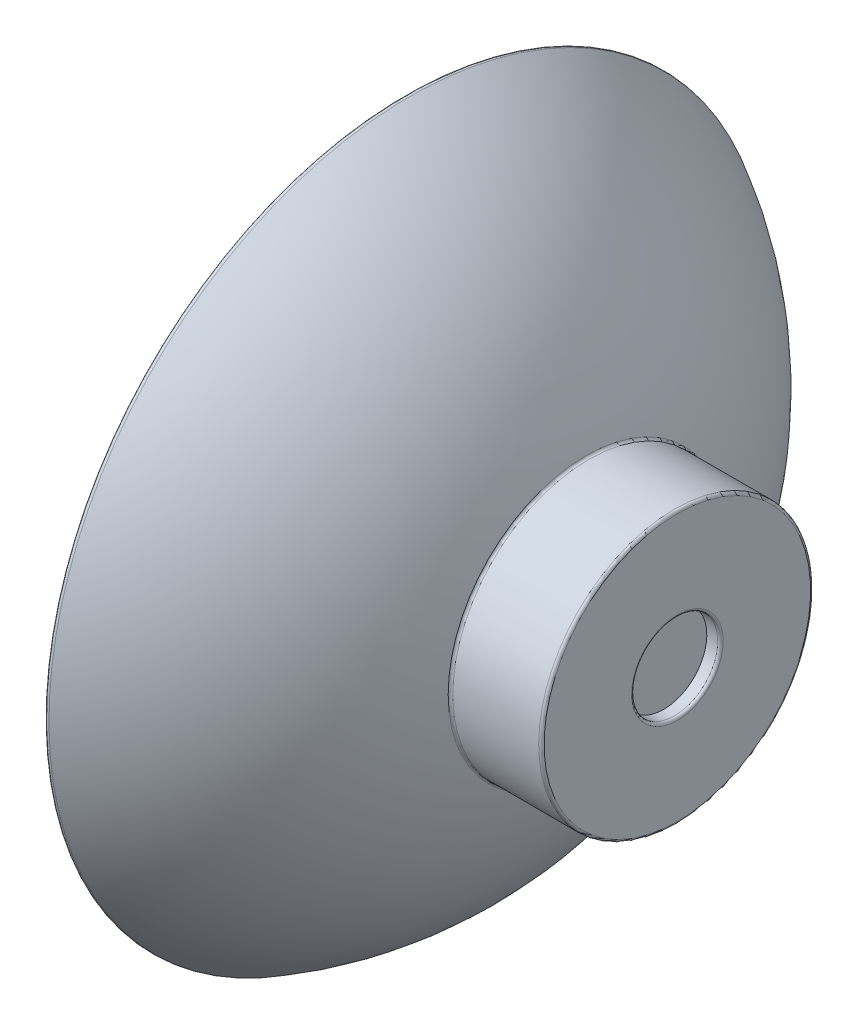
ISO-10303-21;
HEADER;
FILE_DESCRIPTION(('STEP AP214'),'2;1');
FILE_NAME('part.step','',(''),(''),'','','');
FILE_SCHEMA(('AUTOMOTIVE_DESIGN { 1 0 10303 214 1 1 1 1 }'));
ENDSEC;
DATA;
#1=APPLICATION_CONTEXT('core data for automotive mechanical design processes');
#2=APPLICATION_PROTOCOL_DEFINITION('international standard','automotive_design',2000,#1);
#3=PRODUCT_CONTEXT('',#1,'mechanical');
#4=PRODUCT('Part','Part','',(#3));
#5=PRODUCT_RELATED_PRODUCT_CATEGORY('part','',(#4));
#6=PRODUCT_DEFINITION_FORMATION('','',#4);
#7=PRODUCT_DEFINITION_CONTEXT('part definition',#1,'design');
#8=PRODUCT_DEFINITION('design','',#6,#7);
#9=PRODUCT_DEFINITION_SHAPE('','',#8);
#10=(LENGTH_UNIT() NAMED_UNIT(*) SI_UNIT(.MILLI.,.METRE.));
#11=(NAMED_UNIT(*) PLANE_ANGLE_UNIT() SI_UNIT($,.RADIAN.));
#12=(NAMED_UNIT(*) SI_UNIT($,.STERADIAN.) SOLID_ANGLE_UNIT());
#13=UNCERTAINTY_MEASURE_WITH_UNIT(LENGTH_MEASURE(1.E-05),#10,'distance_accuracy_value','');
#14=(GEOMETRIC_REPRESENTATION_CONTEXT(3) GLOBAL_UNCERTAINTY_ASSIGNED_CONTEXT((#13)) GLOBAL_UNIT_ASSIGNED_CONTEXT((#10,
#11,#12)) REPRESENTATION_CONTEXT('',''));
#15=CARTESIAN_POINT('',(0.,0.,0.));
#16=DIRECTION('',(0.,0.,1.));
#17=DIRECTION('',(1.,0.,0.));
#18=AXIS2_PLACEMENT_3D('',#15,#16,#17);
#19=CARTESIAN_POINT('',(-10.,0.,0.));
#20=DIRECTION('',(-1.,0.,0.));
#21=DIRECTION('',(0.,-1.,0.));
#22=AXIS2_PLACEMENT_3D('',#19,#20,#21);
#23=PLANE('',#22);
#24=CARTESIAN_POINT('',(-10.,0.,0.));
#25=DIRECTION('',(-1.,0.,0.));
#26=DIRECTION('',(0.,-1.,0.));
#27=AXIS2_PLACEMENT_3D('',#24,#25,#26);
#28=CIRCLE('',#27,19.7498201412628);
#29=CARTESIAN_POINT('',(-10.,-19.7498201412628,0.));
#30=VERTEX_POINT('',#29);
#31=EDGE_CURVE('E58',#30,#30,#28,.T.);
#32=ORIENTED_EDGE('',*,*,#31,.T.);
#33=EDGE_LOOP('',(#32));
#34=FACE_BOUND('',#33,.T.);
#35=CARTESIAN_POINT('',(-10.,0.,0.));
#36=DIRECTION('',(-1.,0.,0.));
#37=DIRECTION('',(0.,-1.,0.));
#38=AXIS2_PLACEMENT_3D('',#35,#36,#37);
#39=CIRCLE('',#38,18.9049521813844);
#40=CARTESIAN_POINT('',(-10.,-18.9049521813844,0.));
#41=VERTEX_POINT('',#40);
#42=EDGE_CURVE('E88',#41,#41,#39,.F.);
#43=ORIENTED_EDGE('',*,*,#42,.T.);
#44=EDGE_LOOP('',(#43));
#45=FACE_BOUND('',#44,.T.);
#46=ADVANCED_FACE('F46',(#34,#45),#23,.T.);
#47=CARTESIAN_POINT('',(-21.663773257461,0.,0.));
#48=DIRECTION('',(1.,0.,0.));
#49=DIRECTION('',(0.,1.,0.));
#50=AXIS2_PLACEMENT_3D('',#47,#48,#49);
#51=DEGENERATE_TOROIDAL_SURFACE('',#50,0.168430054231302,22.,.T.);
#52=CARTESIAN_POINT('',(-9.93000297917016,0.,0.));
#53=DIRECTION('',(-1.,0.,0.));
#54=DIRECTION('',(0.,-1.,0.));
#55=AXIS2_PLACEMENT_3D('',#52,#53,#54);
#56=CIRCLE('',#55,18.7780682843608);
#57=CARTESIAN_POINT('',(-9.93000297917016,-18.7780682843608,0.));
#58=VERTEX_POINT('',#57);
#59=EDGE_CURVE('E82',#58,#58,#56,.T.);
#60=ORIENTED_EDGE('',*,*,#59,.T.);
#61=EDGE_LOOP('',(#60));
#62=FACE_BOUND('',#61,.T.);
#63=CARTESIAN_POINT('',(-0.00230819274053828,0.,0.));
#64=DIRECTION('',(-1.,0.,0.));
#65=DIRECTION('',(0.,-1.,0.));
#66=AXIS2_PLACEMENT_3D('',#63,#64,#65);
#67=CIRCLE('',#66,4.01302772497597);
#68=CARTESIAN_POINT('',(-0.00230819274053779,-4.01302772497597,0.));
#69=VERTEX_POINT('',#68);
#70=EDGE_CURVE('E85',#69,#69,#67,.F.);
#71=ORIENTED_EDGE('',*,*,#70,.T.);
#72=EDGE_LOOP('',(#71));
#73=FACE_BOUND('',#72,.T.);
#74=ADVANCED_FACE('F117',(#62,#73),#51,.F.);
#75=CARTESIAN_POINT('',(0.,0.,0.));
#76=DIRECTION('',(1.,0.,0.));
#77=DIRECTION('',(0.,1.,0.));
#78=AXIS2_PLACEMENT_3D('',#75,#76,#77);
#79=PLANE('',#78);
#80=CARTESIAN_POINT('',(0.,0.,0.));
#81=DIRECTION('',(1.,0.,0.));
#82=DIRECTION('',(0.,1.,0.));
#83=AXIS2_PLACEMENT_3D('',#80,#81,#82);
#84=CIRCLE('',#83,3.98681455903907);
#85=CARTESIAN_POINT('',(0.,3.98681455903907,0.));
#86=VERTEX_POINT('',#85);
#87=EDGE_CURVE('E79',#86,#86,#84,.F.);
#88=ORIENTED_EDGE('',*,*,#87,.T.);
#89=EDGE_LOOP('',(#88));
#90=FACE_BOUND('',#89,.T.);
#91=ADVANCED_FACE('F123',(#90),#79,.F.);
#92=CARTESIAN_POINT('',(5.,0.,0.));
#93=DIRECTION('',(-1.,0.,0.));
#94=DIRECTION('',(0.,-1.,0.));
#95=AXIS2_PLACEMENT_3D('',#92,#93,#94);
#96=PLANE('',#95);
#97=CARTESIAN_POINT('',(5.,0.,0.));
#98=DIRECTION('',(-1.,0.,0.));
#99=DIRECTION('',(0.,-1.,0.));
#100=AXIS2_PLACEMENT_3D('',#97,#98,#99);
#101=CIRCLE('',#100,2.525);
#102=CARTESIAN_POINT('',(5.,-2.525,0.));
#103=VERTEX_POINT('',#102);
#104=EDGE_CURVE('E11',#103,#103,#101,.T.);
#105=ORIENTED_EDGE('',*,*,#104,.T.);
#106=EDGE_LOOP('',(#105));
#107=FACE_BOUND('',#106,.T.);
#108=CARTESIAN_POINT('',(5.,0.,0.));
#109=DIRECTION('',(-1.,0.,0.));
#110=DIRECTION('',(0.,-1.,0.));
#111=AXIS2_PLACEMENT_3D('',#108,#109,#110);
#112=CIRCLE('',#111,7.35);
#113=CARTESIAN_POINT('',(5.,-7.35,0.));
#114=VERTEX_POINT('',#113);
#115=EDGE_CURVE('E67',#114,#114,#112,.F.);
#116=ORIENTED_EDGE('',*,*,#115,.T.);
#117=EDGE_LOOP('',(#116));
#118=FACE_BOUND('',#117,.T.);
#119=ADVANCED_FACE('F160',(#107,#118),#96,.F.);
#120=CARTESIAN_POINT('',(0.,0.,0.));
#121=DIRECTION('',(1.,0.,0.));
#122=DIRECTION('',(0.,1.,0.));
#123=AXIS2_PLACEMENT_3D('',#120,#121,#122);
#124=CYLINDRICAL_SURFACE('',#123,7.5);
#125=CARTESIAN_POINT('',(0.114614627606932,0.,0.));
#126=DIRECTION('',(1.,0.,0.));
#127=DIRECTION('',(0.,1.,0.));
#128=AXIS2_PLACEMENT_3D('',#125,#126,#127);
#129=CIRCLE('',#128,7.5);
#130=CARTESIAN_POINT('',(0.114614627606932,7.5,0.));
#131=VERTEX_POINT('',#130);
#132=EDGE_CURVE('E73',#131,#131,#129,.T.);
#133=ORIENTED_EDGE('',*,*,#132,.T.);
#134=EDGE_LOOP('',(#133));
#135=FACE_BOUND('',#134,.T.);
#136=CARTESIAN_POINT('',(4.85,0.,0.));
#137=DIRECTION('',(-1.,0.,0.));
#138=DIRECTION('',(0.,-1.,0.));
#139=AXIS2_PLACEMENT_3D('',#136,#137,#138);
#140=CIRCLE('',#139,7.5);
#141=CARTESIAN_POINT('',(4.85,-7.5,0.));
#142=VERTEX_POINT('',#141);
#143=EDGE_CURVE('E76',#142,#142,#140,.T.);
#144=ORIENTED_EDGE('',*,*,#143,.T.);
#145=EDGE_LOOP('',(#144));
#146=FACE_BOUND('',#145,.T.);
#147=ADVANCED_FACE('F113',(#135,#146),#124,.T.);
#148=CARTESIAN_POINT('',(-19.3122304000596,0.,0.));
#149=DIRECTION('',(1.,0.,0.));
#150=DIRECTION('',(0.,1.,0.));
#151=AXIS2_PLACEMENT_3D('',#148,#149,#150);
#152=DEGENERATE_TOROIDAL_SURFACE('',#151,2.30021567995232,20.,.T.);
#153=CARTESIAN_POINT('',(-9.77849699949577,0.,0.));
#154=DIRECTION('',(-1.,0.,0.));
#155=DIRECTION('',(0.,-1.,0.));
#156=AXIS2_PLACEMENT_3D('',#153,#154,#155);
#157=CIRCLE('',#156,19.8816811321543);
#158=CARTESIAN_POINT('',(-9.77849699949577,-19.8816811321543,0.));
#159=VERTEX_POINT('',#158);
#160=EDGE_CURVE('E62',#159,#159,#157,.F.);
#161=ORIENTED_EDGE('',*,*,#160,.T.);
#162=EDGE_LOOP('',(#161));
#163=FACE_BOUND('',#162,.T.);
#164=CARTESIAN_POINT('',(-0.0300020847578304,0.,0.));
#165=DIRECTION('',(-1.,0.,0.));
#166=DIRECTION('',(0.,-1.,0.));
#167=AXIS2_PLACEMENT_3D('',#164,#165,#166);
#168=CIRCLE('',#167,7.61017530282843);
#169=CARTESIAN_POINT('',(-0.0300020847578295,-7.61017530282843,0.));
#170=VERTEX_POINT('',#169);
#171=EDGE_CURVE('E70',#170,#170,#168,.T.);
#172=ORIENTED_EDGE('',*,*,#171,.T.);
#173=EDGE_LOOP('',(#172));
#174=FACE_BOUND('',#173,.T.);
#175=ADVANCED_FACE('F105',(#163,#174),#152,.T.);
#176=CARTESIAN_POINT('',(4.25,0.,0.));
#177=DIRECTION('',(1.,0.,0.));
#178=DIRECTION('',(0.,1.,0.));
#179=AXIS2_PLACEMENT_3D('',#176,#177,#178);
#180=CYLINDRICAL_SURFACE('',#179,2.375);
#181=CARTESIAN_POINT('',(4.85,0.,0.));
#182=DIRECTION('',(-1.,0.,0.));
#183=DIRECTION('',(0.,-1.,0.));
#184=AXIS2_PLACEMENT_3D('',#181,#182,#183);
#185=CIRCLE('',#184,2.375);
#186=CARTESIAN_POINT('',(4.85,-2.375,0.));
#187=VERTEX_POINT('',#186);
#188=EDGE_CURVE('E54',#187,#187,#185,.F.);
#189=ORIENTED_EDGE('',*,*,#188,.T.);
#190=EDGE_LOOP('',(#189));
#191=FACE_BOUND('',#190,.T.);
#192=CARTESIAN_POINT('',(4.25,0.,0.));
#193=DIRECTION('',(1.,0.,0.));
#194=DIRECTION('',(0.,1.,0.));
#195=AXIS2_PLACEMENT_3D('',#192,#193,#194);
#196=CIRCLE('',#195,2.375);
#197=CARTESIAN_POINT('',(4.25,2.375,0.));
#198=VERTEX_POINT('',#197);
#199=EDGE_CURVE('E97',#198,#198,#196,.T.);
#200=ORIENTED_EDGE('',*,*,#199,.F.);
#201=EDGE_LOOP('',(#200));
#202=FACE_BOUND('',#201,.T.);
#203=ADVANCED_FACE('F103',(#191,#202),#180,.F.);
#204=CARTESIAN_POINT('',(4.25,0.,0.));
#205=DIRECTION('',(1.,0.,0.));
#206=DIRECTION('',(0.,1.,0.));
#207=AXIS2_PLACEMENT_3D('',#204,#205,#206);
#208=PLANE('',#207);
#209=ORIENTED_EDGE('',*,*,#199,.T.);
#210=EDGE_LOOP('',(#209));
#211=FACE_BOUND('',#210,.T.);
#212=ADVANCED_FACE('F101',(#211),#208,.T.);
#213=CARTESIAN_POINT('',(-9.85,0.,0.));
#214=DIRECTION('',(-1.,0.,0.));
#215=DIRECTION('',(0.,-1.,0.));
#216=AXIS2_PLACEMENT_3D('',#213,#214,#215);
#217=TOROIDAL_SURFACE('',#216,18.9049521813844,0.15);
#218=ORIENTED_EDGE('',*,*,#59,.F.);
#219=EDGE_LOOP('',(#218));
#220=FACE_BOUND('',#219,.T.);
#221=ORIENTED_EDGE('',*,*,#42,.F.);
#222=EDGE_LOOP('',(#221));
#223=FACE_BOUND('',#222,.T.);
#224=ADVANCED_FACE('F111',(#220,#223),#217,.T.);
#225=CARTESIAN_POINT('',(-0.150000000000001,0.,0.));
#226=DIRECTION('',(1.,0.,0.));
#227=DIRECTION('',(0.,1.,0.));
#228=AXIS2_PLACEMENT_3D('',#225,#226,#227);
#229=TOROIDAL_SURFACE('',#228,3.98681455903907,0.15);
#230=ORIENTED_EDGE('',*,*,#87,.F.);
#231=EDGE_LOOP('',(#230));
#232=FACE_BOUND('',#231,.T.);
#233=ORIENTED_EDGE('',*,*,#70,.F.);
#234=EDGE_LOOP('',(#233));
#235=FACE_BOUND('',#234,.T.);
#236=ADVANCED_FACE('F131',(#232,#235),#229,.F.);
#237=CARTESIAN_POINT('',(0.114614627606932,0.,0.));
#238=DIRECTION('',(1.,0.,0.));
#239=DIRECTION('',(0.,1.,0.));
#240=AXIS2_PLACEMENT_3D('',#237,#238,#239);
#241=TOROIDAL_SURFACE('',#240,7.65,0.15);
#242=ORIENTED_EDGE('',*,*,#171,.F.);
#243=EDGE_LOOP('',(#242));
#244=FACE_BOUND('',#243,.T.);
#245=ORIENTED_EDGE('',*,*,#132,.F.);
#246=EDGE_LOOP('',(#245));
#247=FACE_BOUND('',#246,.T.);
#248=ADVANCED_FACE('F135',(#244,#247),#241,.F.);
#249=CARTESIAN_POINT('',(4.85,0.,0.));
#250=DIRECTION('',(-1.,0.,0.));
#251=DIRECTION('',(0.,-1.,0.));
#252=AXIS2_PLACEMENT_3D('',#249,#250,#251);
#253=TOROIDAL_SURFACE('',#252,7.35,0.15);
#254=ORIENTED_EDGE('',*,*,#143,.F.);
#255=EDGE_LOOP('',(#254));
#256=FACE_BOUND('',#255,.T.);
#257=ORIENTED_EDGE('',*,*,#115,.F.);
#258=EDGE_LOOP('',(#257));
#259=FACE_BOUND('',#258,.T.);
#260=ADVANCED_FACE('F139',(#256,#259),#253,.T.);
#261=CARTESIAN_POINT('',(-9.85,0.,0.));
#262=DIRECTION('',(-1.,0.,0.));
#263=DIRECTION('',(0.,-1.,0.));
#264=AXIS2_PLACEMENT_3D('',#261,#262,#263);
#265=TOROIDAL_SURFACE('',#264,19.7498201412628,0.15);
#266=ORIENTED_EDGE('',*,*,#31,.F.);
#267=EDGE_LOOP('',(#266));
#268=FACE_BOUND('',#267,.T.);
#269=ORIENTED_EDGE('',*,*,#160,.F.);
#270=EDGE_LOOP('',(#269));
#271=FACE_BOUND('',#270,.T.);
#272=ADVANCED_FACE('F142',(#268,#271),#265,.T.);
#273=CARTESIAN_POINT('',(4.85,0.,0.));
#274=DIRECTION('',(-1.,0.,0.));
#275=DIRECTION('',(0.,-1.,0.));
#276=AXIS2_PLACEMENT_3D('',#273,#274,#275);
#277=TOROIDAL_SURFACE('',#276,2.525,0.15);
#278=ORIENTED_EDGE('',*,*,#104,.F.);
#279=EDGE_LOOP('',(#278));
#280=FACE_BOUND('',#279,.T.);
#281=ORIENTED_EDGE('',*,*,#188,.F.);
#282=EDGE_LOOP('',(#281));
#283=FACE_BOUND('',#282,.T.);
#284=ADVANCED_FACE('F48',(#280,#283),#277,.T.);
#285=CLOSED_SHELL('',(#46,#74,#91,#119,#147,#175,#203,#212,#224,#236,#248,#260,#272,#284));
#286=CARTESIAN_POINT('',(2.,0.,0.));
#287=DIRECTION('',(1.,0.,0.));
#288=DIRECTION('',(0.,1.,0.));
#289=AXIS2_PLACEMENT_3D('',#286,#287,#288);
#290=PLANE('',#289);
#291=CARTESIAN_POINT('',(2.,0.,0.));
#292=DIRECTION('',(1.,0.,0.));
#293=DIRECTION('',(0.,1.,0.));
#294=AXIS2_PLACEMENT_3D('',#291,#292,#293);
#295=CIRCLE('',#294,4.75);
#296=CARTESIAN_POINT('',(2.,4.75,0.));
#297=VERTEX_POINT('',#296);
#298=EDGE_CURVE('E91',#297,#297,#295,.T.);
#299=ORIENTED_EDGE('',*,*,#298,.T.);
#300=EDGE_LOOP('',(#299));
#301=FACE_BOUND('',#300,.T.);
#302=ADVANCED_FACE('F181',(#301),#290,.T.);
#303=CARTESIAN_POINT('',(0.,0.,0.));
#304=DIRECTION('',(1.,0.,0.));
#305=DIRECTION('',(0.,1.,0.));
#306=AXIS2_PLACEMENT_3D('',#303,#304,#305);
#307=CYLINDRICAL_SURFACE('',#306,4.75);
#308=CARTESIAN_POINT('',(4.,0.,0.));
#309=DIRECTION('',(1.,0.,0.));
#310=DIRECTION('',(0.,1.,0.));
#311=AXIS2_PLACEMENT_3D('',#308,#309,#310);
#312=CIRCLE('',#311,4.75);
#313=CARTESIAN_POINT('',(4.,4.75,0.));
#314=VERTEX_POINT('',#313);
#315=EDGE_CURVE('E94',#314,#314,#312,.T.);
#316=ORIENTED_EDGE('',*,*,#315,.T.);
#317=EDGE_LOOP('',(#316));
#318=FACE_BOUND('',#317,.T.);
#319=ORIENTED_EDGE('',*,*,#298,.F.);
#320=EDGE_LOOP('',(#319));
#321=FACE_BOUND('',#320,.T.);
#322=ADVANCED_FACE('F176',(#318,#321),#307,.F.);
#323=CARTESIAN_POINT('',(4.,0.,0.));
#324=DIRECTION('',(-1.,0.,0.));
#325=DIRECTION('',(0.,-1.,0.));
#326=AXIS2_PLACEMENT_3D('',#323,#324,#325);
#327=PLANE('',#326);
#328=ORIENTED_EDGE('',*,*,#315,.F.);
#329=EDGE_LOOP('',(#328));
#330=FACE_BOUND('',#329,.T.);
#331=ADVANCED_FACE('F173',(#330),#327,.T.);
#332=CLOSED_SHELL('',(#302,#322,#331));
#333=ORIENTED_CLOSED_SHELL('',*,#332,.T.);
#334=BREP_WITH_VOIDS('B2',#285,(#333));
#335=ADVANCED_BREP_SHAPE_REPRESENTATION('',(#18,#334),#14);
#336=SHAPE_DEFINITION_REPRESENTATION(#9,#335);
ENDSEC;
END-ISO-10303-21;
